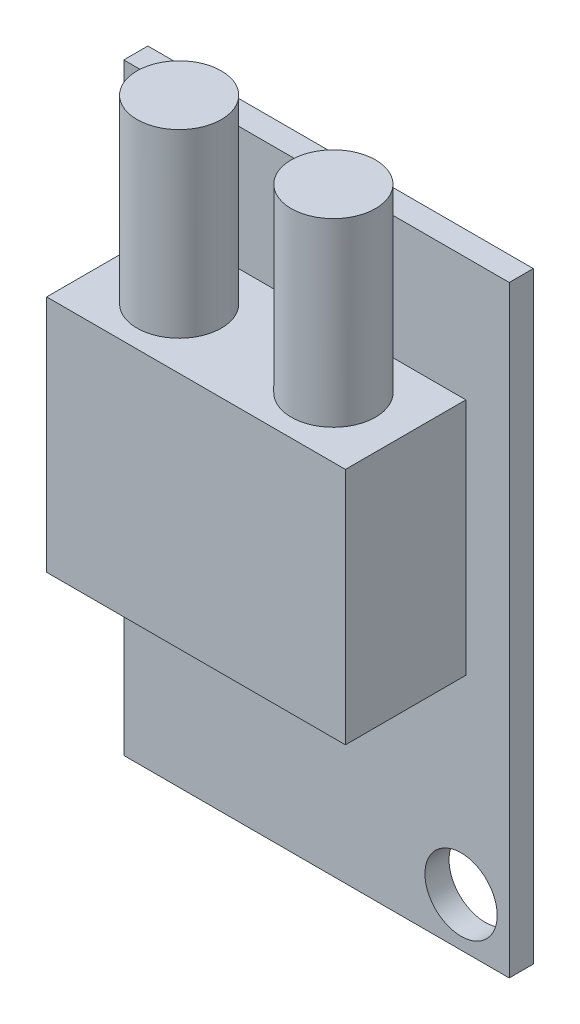
ISO-10303-21;
HEADER;
FILE_DESCRIPTION(('STEP AP214'),'2;1');
FILE_NAME('part.step','',(''),(''),'','','');
FILE_SCHEMA(('AUTOMOTIVE_DESIGN { 1 0 10303 214 1 1 1 1 }'));
ENDSEC;
DATA;
#1=APPLICATION_CONTEXT('core data for automotive mechanical design processes');
#2=APPLICATION_PROTOCOL_DEFINITION('international standard','automotive_design',2000,#1);
#3=PRODUCT_CONTEXT('',#1,'mechanical');
#4=PRODUCT('Part','Part','',(#3));
#5=PRODUCT_RELATED_PRODUCT_CATEGORY('part','',(#4));
#6=PRODUCT_DEFINITION_FORMATION('','',#4);
#7=PRODUCT_DEFINITION_CONTEXT('part definition',#1,'design');
#8=PRODUCT_DEFINITION('design','',#6,#7);
#9=PRODUCT_DEFINITION_SHAPE('','',#8);
#10=(LENGTH_UNIT() NAMED_UNIT(*) SI_UNIT(.MILLI.,.METRE.));
#11=(NAMED_UNIT(*) PLANE_ANGLE_UNIT() SI_UNIT($,.RADIAN.));
#12=(NAMED_UNIT(*) SI_UNIT($,.STERADIAN.) SOLID_ANGLE_UNIT());
#13=UNCERTAINTY_MEASURE_WITH_UNIT(LENGTH_MEASURE(1.E-05),#10,'distance_accuracy_value','');
#14=(GEOMETRIC_REPRESENTATION_CONTEXT(3) GLOBAL_UNCERTAINTY_ASSIGNED_CONTEXT((#13)) GLOBAL_UNIT_ASSIGNED_CONTEXT((#10,
#11,#12)) REPRESENTATION_CONTEXT('',''));
#15=CARTESIAN_POINT('',(0.,0.,0.));
#16=DIRECTION('',(0.,0.,1.));
#17=DIRECTION('',(1.,0.,0.));
#18=AXIS2_PLACEMENT_3D('',#15,#16,#17);
#19=CARTESIAN_POINT('',(0.,0.,1.));
#20=DIRECTION('',(0.,0.,-1.));
#21=DIRECTION('',(-1.,0.,0.));
#22=AXIS2_PLACEMENT_3D('',#19,#20,#21);
#23=PLANE('',#22);
#24=DIRECTION('',(0.,-1.,0.));
#25=VECTOR('',#24,1.);
#26=CARTESIAN_POINT('',(0.,0.,1.));
#27=LINE('',#26,#25);
#28=CARTESIAN_POINT('',(0.,25.,1.));
#29=VERTEX_POINT('',#28);
#30=CARTESIAN_POINT('',(0.,0.,1.));
#31=VERTEX_POINT('',#30);
#32=EDGE_CURVE('E137',#29,#31,#27,.T.);
#33=ORIENTED_EDGE('',*,*,#32,.T.);
#34=DIRECTION('',(1.,0.,0.));
#35=VECTOR('',#34,1.);
#36=CARTESIAN_POINT('',(0.,0.,1.));
#37=LINE('',#36,#35);
#38=CARTESIAN_POINT('',(16.,0.,1.));
#39=VERTEX_POINT('',#38);
#40=EDGE_CURVE('E140',#31,#39,#37,.T.);
#41=ORIENTED_EDGE('',*,*,#40,.T.);
#42=DIRECTION('',(0.,1.,0.));
#43=VECTOR('',#42,1.);
#44=CARTESIAN_POINT('',(16.,0.,1.));
#45=LINE('',#44,#43);
#46=CARTESIAN_POINT('',(16.,25.,1.));
#47=VERTEX_POINT('',#46);
#48=EDGE_CURVE('E143',#39,#47,#45,.T.);
#49=ORIENTED_EDGE('',*,*,#48,.T.);
#50=DIRECTION('',(-1.,0.,0.));
#51=VECTOR('',#50,1.);
#52=CARTESIAN_POINT('',(0.,25.,1.));
#53=LINE('',#52,#51);
#54=EDGE_CURVE('E145',#47,#29,#53,.T.);
#55=ORIENTED_EDGE('',*,*,#54,.T.);
#56=EDGE_LOOP('',(#33,#41,#49,#55));
#57=FACE_BOUND('',#56,.T.);
#58=CARTESIAN_POINT('',(2.,23.,1.));
#59=DIRECTION('',(0.,0.,1.));
#60=DIRECTION('',(1.,0.,0.));
#61=AXIS2_PLACEMENT_3D('',#58,#59,#60);
#62=CIRCLE('',#61,1.5);
#63=CARTESIAN_POINT('',(3.5,23.,1.));
#64=VERTEX_POINT('',#63);
#65=EDGE_CURVE('E129',#64,#64,#62,.T.);
#66=ORIENTED_EDGE('',*,*,#65,.F.);
#67=EDGE_LOOP('',(#66));
#68=FACE_BOUND('',#67,.T.);
#69=CARTESIAN_POINT('',(14.,2.,1.));
#70=DIRECTION('',(0.,0.,1.));
#71=DIRECTION('',(1.,0.,0.));
#72=AXIS2_PLACEMENT_3D('',#69,#70,#71);
#73=CIRCLE('',#72,1.5);
#74=CARTESIAN_POINT('',(15.5,2.,1.));
#75=VERTEX_POINT('',#74);
#76=EDGE_CURVE('E119',#75,#75,#73,.T.);
#77=ORIENTED_EDGE('',*,*,#76,.F.);
#78=EDGE_LOOP('',(#77));
#79=FACE_BOUND('',#78,.T.);
#80=DIRECTION('',(0.,-1.,0.));
#81=VECTOR('',#80,1.);
#82=CARTESIAN_POINT('',(1.8,19.8816424786027,1.));
#83=LINE('',#82,#81);
#84=CARTESIAN_POINT('',(1.8,19.8816424786027,1.));
#85=VERTEX_POINT('',#84);
#86=CARTESIAN_POINT('',(1.8,9.98164247860267,1.));
#87=VERTEX_POINT('',#86);
#88=EDGE_CURVE('E118',#85,#87,#83,.T.);
#89=ORIENTED_EDGE('',*,*,#88,.F.);
#90=DIRECTION('',(-1.,0.,0.));
#91=VECTOR('',#90,1.);
#92=CARTESIAN_POINT('',(1.8,19.8816424786027,1.));
#93=LINE('',#92,#91);
#94=CARTESIAN_POINT('',(14.2,19.8816424786027,1.));
#95=VERTEX_POINT('',#94);
#96=EDGE_CURVE('E115',#95,#85,#93,.T.);
#97=ORIENTED_EDGE('',*,*,#96,.F.);
#98=DIRECTION('',(0.,1.,0.));
#99=VECTOR('',#98,1.);
#100=CARTESIAN_POINT('',(14.2,19.8816424786027,1.));
#101=LINE('',#100,#99);
#102=CARTESIAN_POINT('',(14.2,9.98164247860267,1.));
#103=VERTEX_POINT('',#102);
#104=EDGE_CURVE('E53',#103,#95,#101,.T.);
#105=ORIENTED_EDGE('',*,*,#104,.F.);
#106=DIRECTION('',(1.,0.,0.));
#107=VECTOR('',#106,1.);
#108=CARTESIAN_POINT('',(1.8,9.98164247860267,1.));
#109=LINE('',#108,#107);
#110=EDGE_CURVE('E48',#87,#103,#109,.T.);
#111=ORIENTED_EDGE('',*,*,#110,.F.);
#112=EDGE_LOOP('',(#89,#97,#105,#111));
#113=FACE_BOUND('',#112,.T.);
#114=ADVANCED_FACE('F33',(#57,#68,#79,#113),#23,.F.);
#115=CARTESIAN_POINT('',(0.,0.,1.));
#116=DIRECTION('',(1.,0.,0.));
#117=DIRECTION('',(0.,0.,-1.));
#118=AXIS2_PLACEMENT_3D('',#115,#116,#117);
#119=PLANE('',#118);
#120=DIRECTION('',(0.,-1.,0.));
#121=VECTOR('',#120,1.);
#122=CARTESIAN_POINT('',(0.,0.,0.));
#123=LINE('',#122,#121);
#124=CARTESIAN_POINT('',(0.,25.,0.));
#125=VERTEX_POINT('',#124);
#126=CARTESIAN_POINT('',(0.,0.,0.));
#127=VERTEX_POINT('',#126);
#128=EDGE_CURVE('E134',#125,#127,#123,.T.);
#129=ORIENTED_EDGE('',*,*,#128,.T.);
#130=DIRECTION('',(0.,0.,-1.));
#131=VECTOR('',#130,1.);
#132=CARTESIAN_POINT('',(0.,0.,1.));
#133=LINE('',#132,#131);
#134=EDGE_CURVE('E163',#31,#127,#133,.T.);
#135=ORIENTED_EDGE('',*,*,#134,.F.);
#136=ORIENTED_EDGE('',*,*,#32,.F.);
#137=DIRECTION('',(0.,0.,-1.));
#138=VECTOR('',#137,1.);
#139=CARTESIAN_POINT('',(0.,25.,1.));
#140=LINE('',#139,#138);
#141=EDGE_CURVE('E147',#29,#125,#140,.T.);
#142=ORIENTED_EDGE('',*,*,#141,.T.);
#143=EDGE_LOOP('',(#129,#135,#136,#142));
#144=FACE_BOUND('',#143,.T.);
#145=ADVANCED_FACE('F35',(#144),#119,.F.);
#146=CARTESIAN_POINT('',(0.,0.,1.));
#147=DIRECTION('',(0.,1.,0.));
#148=DIRECTION('',(0.,0.,1.));
#149=AXIS2_PLACEMENT_3D('',#146,#147,#148);
#150=PLANE('',#149);
#151=DIRECTION('',(1.,0.,0.));
#152=VECTOR('',#151,1.);
#153=CARTESIAN_POINT('',(0.,0.,0.));
#154=LINE('',#153,#152);
#155=CARTESIAN_POINT('',(16.,0.,0.));
#156=VERTEX_POINT('',#155);
#157=EDGE_CURVE('E150',#127,#156,#154,.T.);
#158=ORIENTED_EDGE('',*,*,#157,.T.);
#159=DIRECTION('',(0.,0.,-1.));
#160=VECTOR('',#159,1.);
#161=CARTESIAN_POINT('',(16.,0.,1.));
#162=LINE('',#161,#160);
#163=EDGE_CURVE('E160',#39,#156,#162,.T.);
#164=ORIENTED_EDGE('',*,*,#163,.F.);
#165=ORIENTED_EDGE('',*,*,#40,.F.);
#166=ORIENTED_EDGE('',*,*,#134,.T.);
#167=EDGE_LOOP('',(#158,#164,#165,#166));
#168=FACE_BOUND('',#167,.T.);
#169=ADVANCED_FACE('F216',(#168),#150,.F.);
#170=CARTESIAN_POINT('',(16.,0.,1.));
#171=DIRECTION('',(-1.,0.,0.));
#172=DIRECTION('',(0.,0.,1.));
#173=AXIS2_PLACEMENT_3D('',#170,#171,#172);
#174=PLANE('',#173);
#175=DIRECTION('',(0.,1.,0.));
#176=VECTOR('',#175,1.);
#177=CARTESIAN_POINT('',(16.,0.,0.));
#178=LINE('',#177,#176);
#179=CARTESIAN_POINT('',(16.,25.,0.));
#180=VERTEX_POINT('',#179);
#181=EDGE_CURVE('E152',#156,#180,#178,.T.);
#182=ORIENTED_EDGE('',*,*,#181,.T.);
#183=DIRECTION('',(0.,0.,-1.));
#184=VECTOR('',#183,1.);
#185=CARTESIAN_POINT('',(16.,25.,1.));
#186=LINE('',#185,#184);
#187=EDGE_CURVE('E157',#47,#180,#186,.T.);
#188=ORIENTED_EDGE('',*,*,#187,.F.);
#189=ORIENTED_EDGE('',*,*,#48,.F.);
#190=ORIENTED_EDGE('',*,*,#163,.T.);
#191=EDGE_LOOP('',(#182,#188,#189,#190));
#192=FACE_BOUND('',#191,.T.);
#193=ADVANCED_FACE('F230',(#192),#174,.F.);
#194=CARTESIAN_POINT('',(0.,25.,1.));
#195=DIRECTION('',(0.,-1.,0.));
#196=DIRECTION('',(0.,0.,-1.));
#197=AXIS2_PLACEMENT_3D('',#194,#195,#196);
#198=PLANE('',#197);
#199=DIRECTION('',(-1.,0.,0.));
#200=VECTOR('',#199,1.);
#201=CARTESIAN_POINT('',(0.,25.,0.));
#202=LINE('',#201,#200);
#203=EDGE_CURVE('E141',#180,#125,#202,.T.);
#204=ORIENTED_EDGE('',*,*,#203,.T.);
#205=ORIENTED_EDGE('',*,*,#141,.F.);
#206=ORIENTED_EDGE('',*,*,#54,.F.);
#207=ORIENTED_EDGE('',*,*,#187,.T.);
#208=EDGE_LOOP('',(#204,#205,#206,#207));
#209=FACE_BOUND('',#208,.T.);
#210=ADVANCED_FACE('F226',(#209),#198,.F.);
#211=CARTESIAN_POINT('',(0.,0.,0.));
#212=DIRECTION('',(0.,0.,-1.));
#213=DIRECTION('',(-1.,0.,0.));
#214=AXIS2_PLACEMENT_3D('',#211,#212,#213);
#215=PLANE('',#214);
#216=CARTESIAN_POINT('',(14.,2.,0.));
#217=DIRECTION('',(0.,0.,1.));
#218=DIRECTION('',(1.,0.,0.));
#219=AXIS2_PLACEMENT_3D('',#216,#217,#218);
#220=CIRCLE('',#219,1.5);
#221=CARTESIAN_POINT('',(15.5,2.,0.));
#222=VERTEX_POINT('',#221);
#223=EDGE_CURVE('E122',#222,#222,#220,.T.);
#224=ORIENTED_EDGE('',*,*,#223,.T.);
#225=EDGE_LOOP('',(#224));
#226=FACE_BOUND('',#225,.T.);
#227=CARTESIAN_POINT('',(2.,23.,0.));
#228=DIRECTION('',(0.,0.,1.));
#229=DIRECTION('',(1.,0.,0.));
#230=AXIS2_PLACEMENT_3D('',#227,#228,#229);
#231=CIRCLE('',#230,1.5);
#232=CARTESIAN_POINT('',(3.5,23.,0.));
#233=VERTEX_POINT('',#232);
#234=EDGE_CURVE('E131',#233,#233,#231,.T.);
#235=ORIENTED_EDGE('',*,*,#234,.T.);
#236=EDGE_LOOP('',(#235));
#237=FACE_BOUND('',#236,.T.);
#238=ORIENTED_EDGE('',*,*,#128,.F.);
#239=ORIENTED_EDGE('',*,*,#203,.F.);
#240=ORIENTED_EDGE('',*,*,#181,.F.);
#241=ORIENTED_EDGE('',*,*,#157,.F.);
#242=EDGE_LOOP('',(#238,#239,#240,#241));
#243=FACE_BOUND('',#242,.T.);
#244=ADVANCED_FACE('F223',(#226,#237,#243),#215,.T.);
#245=CARTESIAN_POINT('',(2.,23.,0.));
#246=DIRECTION('',(0.,0.,1.));
#247=DIRECTION('',(1.,0.,0.));
#248=AXIS2_PLACEMENT_3D('',#245,#246,#247);
#249=CYLINDRICAL_SURFACE('',#248,1.5);
#250=ORIENTED_EDGE('',*,*,#234,.F.);
#251=EDGE_LOOP('',(#250));
#252=FACE_BOUND('',#251,.T.);
#253=ORIENTED_EDGE('',*,*,#65,.T.);
#254=EDGE_LOOP('',(#253));
#255=FACE_BOUND('',#254,.T.);
#256=ADVANCED_FACE('F221',(#252,#255),#249,.F.);
#257=CARTESIAN_POINT('',(14.,2.,0.));
#258=DIRECTION('',(0.,0.,1.));
#259=DIRECTION('',(1.,0.,0.));
#260=AXIS2_PLACEMENT_3D('',#257,#258,#259);
#261=CYLINDRICAL_SURFACE('',#260,1.5);
#262=ORIENTED_EDGE('',*,*,#223,.F.);
#263=EDGE_LOOP('',(#262));
#264=FACE_BOUND('',#263,.T.);
#265=ORIENTED_EDGE('',*,*,#76,.T.);
#266=EDGE_LOOP('',(#265));
#267=FACE_BOUND('',#266,.T.);
#268=ADVANCED_FACE('F269',(#264,#267),#261,.F.);
#269=CARTESIAN_POINT('',(1.8,19.8816424786027,6.));
#270=DIRECTION('',(1.,0.,0.));
#271=DIRECTION('',(0.,0.,-1.));
#272=AXIS2_PLACEMENT_3D('',#269,#270,#271);
#273=PLANE('',#272);
#274=ORIENTED_EDGE('',*,*,#88,.T.);
#275=DIRECTION('',(0.,0.,-1.));
#276=VECTOR('',#275,1.);
#277=CARTESIAN_POINT('',(1.8,9.98164247860267,6.));
#278=LINE('',#277,#276);
#279=CARTESIAN_POINT('',(1.8,9.98164247860267,6.));
#280=VERTEX_POINT('',#279);
#281=EDGE_CURVE('E99',#280,#87,#278,.T.);
#282=ORIENTED_EDGE('',*,*,#281,.F.);
#283=DIRECTION('',(0.,-1.,0.));
#284=VECTOR('',#283,1.);
#285=CARTESIAN_POINT('',(1.8,19.8816424786027,6.));
#286=LINE('',#285,#284);
#287=CARTESIAN_POINT('',(1.8,19.8816424786027,6.));
#288=VERTEX_POINT('',#287);
#289=EDGE_CURVE('E106',#288,#280,#286,.T.);
#290=ORIENTED_EDGE('',*,*,#289,.F.);
#291=DIRECTION('',(0.,0.,-1.));
#292=VECTOR('',#291,1.);
#293=CARTESIAN_POINT('',(1.8,19.8816424786027,6.));
#294=LINE('',#293,#292);
#295=EDGE_CURVE('E178',#288,#85,#294,.T.);
#296=ORIENTED_EDGE('',*,*,#295,.T.);
#297=EDGE_LOOP('',(#274,#282,#290,#296));
#298=FACE_BOUND('',#297,.T.);
#299=ADVANCED_FACE('F117',(#298),#273,.F.);
#300=CARTESIAN_POINT('',(1.8,9.98164247860267,6.));
#301=DIRECTION('',(0.,1.,0.));
#302=DIRECTION('',(0.,0.,1.));
#303=AXIS2_PLACEMENT_3D('',#300,#301,#302);
#304=PLANE('',#303);
#305=ORIENTED_EDGE('',*,*,#110,.T.);
#306=DIRECTION('',(0.,0.,-1.));
#307=VECTOR('',#306,1.);
#308=CARTESIAN_POINT('',(14.2,9.98164247860267,6.));
#309=LINE('',#308,#307);
#310=CARTESIAN_POINT('',(14.2,9.98164247860267,6.));
#311=VERTEX_POINT('',#310);
#312=EDGE_CURVE('E102',#311,#103,#309,.T.);
#313=ORIENTED_EDGE('',*,*,#312,.F.);
#314=DIRECTION('',(1.,0.,0.));
#315=VECTOR('',#314,1.);
#316=CARTESIAN_POINT('',(1.8,9.98164247860267,6.));
#317=LINE('',#316,#315);
#318=EDGE_CURVE('E95',#280,#311,#317,.T.);
#319=ORIENTED_EDGE('',*,*,#318,.F.);
#320=ORIENTED_EDGE('',*,*,#281,.T.);
#321=EDGE_LOOP('',(#305,#313,#319,#320));
#322=FACE_BOUND('',#321,.T.);
#323=ADVANCED_FACE('F97',(#322),#304,.F.);
#324=CARTESIAN_POINT('',(14.2,19.8816424786027,6.));
#325=DIRECTION('',(-1.,0.,0.));
#326=DIRECTION('',(0.,0.,1.));
#327=AXIS2_PLACEMENT_3D('',#324,#325,#326);
#328=PLANE('',#327);
#329=ORIENTED_EDGE('',*,*,#104,.T.);
#330=DIRECTION('',(0.,0.,-1.));
#331=VECTOR('',#330,1.);
#332=CARTESIAN_POINT('',(14.2,19.8816424786027,6.));
#333=LINE('',#332,#331);
#334=CARTESIAN_POINT('',(14.2,19.8816424786027,6.));
#335=VERTEX_POINT('',#334);
#336=EDGE_CURVE('E124',#335,#95,#333,.T.);
#337=ORIENTED_EDGE('',*,*,#336,.F.);
#338=DIRECTION('',(0.,1.,0.));
#339=VECTOR('',#338,1.);
#340=CARTESIAN_POINT('',(14.2,19.8816424786027,6.));
#341=LINE('',#340,#339);
#342=EDGE_CURVE('E105',#311,#335,#341,.T.);
#343=ORIENTED_EDGE('',*,*,#342,.F.);
#344=ORIENTED_EDGE('',*,*,#312,.T.);
#345=EDGE_LOOP('',(#329,#337,#343,#344));
#346=FACE_BOUND('',#345,.T.);
#347=ADVANCED_FACE('F173',(#346),#328,.F.);
#348=CARTESIAN_POINT('',(1.8,19.8816424786027,6.));
#349=DIRECTION('',(0.,-1.,0.));
#350=DIRECTION('',(0.,0.,-1.));
#351=AXIS2_PLACEMENT_3D('',#348,#349,#350);
#352=PLANE('',#351);
#353=CARTESIAN_POINT('',(11.2,19.8816424786027,3.5));
#354=DIRECTION('',(0.,-1.,0.));
#355=DIRECTION('',(0.,0.,-1.));
#356=AXIS2_PLACEMENT_3D('',#353,#354,#355);
#357=CIRCLE('',#356,1.75);
#358=CARTESIAN_POINT('',(11.2,19.8816424786027,1.75));
#359=VERTEX_POINT('',#358);
#360=EDGE_CURVE('E11',#359,#359,#357,.F.);
#361=ORIENTED_EDGE('',*,*,#360,.F.);
#362=EDGE_LOOP('',(#361));
#363=FACE_BOUND('',#362,.T.);
#364=CARTESIAN_POINT('',(4.8,19.8816424786027,3.5));
#365=DIRECTION('',(0.,-1.,0.));
#366=DIRECTION('',(0.,0.,-1.));
#367=AXIS2_PLACEMENT_3D('',#364,#365,#366);
#368=CIRCLE('',#367,1.75);
#369=CARTESIAN_POINT('',(4.8,19.8816424786027,1.75));
#370=VERTEX_POINT('',#369);
#371=EDGE_CURVE('E41',#370,#370,#368,.F.);
#372=ORIENTED_EDGE('',*,*,#371,.F.);
#373=EDGE_LOOP('',(#372));
#374=FACE_BOUND('',#373,.T.);
#375=ORIENTED_EDGE('',*,*,#96,.T.);
#376=ORIENTED_EDGE('',*,*,#295,.F.);
#377=DIRECTION('',(-1.,0.,0.));
#378=VECTOR('',#377,1.);
#379=CARTESIAN_POINT('',(1.8,19.8816424786027,6.));
#380=LINE('',#379,#378);
#381=EDGE_CURVE('E111',#335,#288,#380,.T.);
#382=ORIENTED_EDGE('',*,*,#381,.F.);
#383=ORIENTED_EDGE('',*,*,#336,.T.);
#384=EDGE_LOOP('',(#375,#376,#382,#383));
#385=FACE_BOUND('',#384,.T.);
#386=ADVANCED_FACE('F170',(#363,#374,#385),#352,.F.);
#387=CARTESIAN_POINT('',(0.,0.,6.));
#388=DIRECTION('',(0.,0.,1.));
#389=DIRECTION('',(1.,0.,0.));
#390=AXIS2_PLACEMENT_3D('',#387,#388,#389);
#391=PLANE('',#390);
#392=ORIENTED_EDGE('',*,*,#289,.T.);
#393=ORIENTED_EDGE('',*,*,#318,.T.);
#394=ORIENTED_EDGE('',*,*,#342,.T.);
#395=ORIENTED_EDGE('',*,*,#381,.T.);
#396=EDGE_LOOP('',(#392,#393,#394,#395));
#397=FACE_BOUND('',#396,.T.);
#398=ADVANCED_FACE('F109',(#397),#391,.T.);
#399=CARTESIAN_POINT('',(4.8,27.3816424786027,3.5));
#400=DIRECTION('',(0.,-1.,0.));
#401=DIRECTION('',(0.,0.,-1.));
#402=AXIS2_PLACEMENT_3D('',#399,#400,#401);
#403=CYLINDRICAL_SURFACE('',#402,1.75);
#404=CARTESIAN_POINT('',(4.8,27.3816424786027,3.5));
#405=DIRECTION('',(0.,1.,0.));
#406=DIRECTION('',(0.,0.,1.));
#407=AXIS2_PLACEMENT_3D('',#404,#405,#406);
#408=CIRCLE('',#407,1.75);
#409=CARTESIAN_POINT('',(4.8,27.3816424786027,5.25));
#410=VERTEX_POINT('',#409);
#411=EDGE_CURVE('E186',#410,#410,#408,.T.);
#412=ORIENTED_EDGE('',*,*,#411,.F.);
#413=EDGE_LOOP('',(#412));
#414=FACE_BOUND('',#413,.T.);
#415=ORIENTED_EDGE('',*,*,#371,.T.);
#416=EDGE_LOOP('',(#415));
#417=FACE_BOUND('',#416,.T.);
#418=ADVANCED_FACE('F168',(#414,#417),#403,.T.);
#419=CARTESIAN_POINT('',(4.8,27.3816424786027,3.5));
#420=DIRECTION('',(0.,1.,0.));
#421=DIRECTION('',(0.,0.,1.));
#422=AXIS2_PLACEMENT_3D('',#419,#420,#421);
#423=PLANE('',#422);
#424=ORIENTED_EDGE('',*,*,#411,.T.);
#425=EDGE_LOOP('',(#424));
#426=FACE_BOUND('',#425,.T.);
#427=ADVANCED_FACE('F200',(#426),#423,.T.);
#428=CARTESIAN_POINT('',(11.2,27.3816424786027,3.5));
#429=DIRECTION('',(0.,-1.,0.));
#430=DIRECTION('',(0.,0.,-1.));
#431=AXIS2_PLACEMENT_3D('',#428,#429,#430);
#432=CYLINDRICAL_SURFACE('',#431,1.75);
#433=CARTESIAN_POINT('',(11.2,27.3816424786027,3.5));
#434=DIRECTION('',(0.,1.,0.));
#435=DIRECTION('',(0.,0.,1.));
#436=AXIS2_PLACEMENT_3D('',#433,#434,#435);
#437=CIRCLE('',#436,1.75);
#438=CARTESIAN_POINT('',(11.2,27.3816424786027,5.25));
#439=VERTEX_POINT('',#438);
#440=EDGE_CURVE('E191',#439,#439,#437,.T.);
#441=ORIENTED_EDGE('',*,*,#440,.F.);
#442=EDGE_LOOP('',(#441));
#443=FACE_BOUND('',#442,.T.);
#444=ORIENTED_EDGE('',*,*,#360,.T.);
#445=EDGE_LOOP('',(#444));
#446=FACE_BOUND('',#445,.T.);
#447=ADVANCED_FACE('F197',(#443,#446),#432,.T.);
#448=CARTESIAN_POINT('',(11.2,27.3816424786027,3.5));
#449=DIRECTION('',(0.,1.,0.));
#450=DIRECTION('',(0.,0.,1.));
#451=AXIS2_PLACEMENT_3D('',#448,#449,#450);
#452=PLANE('',#451);
#453=ORIENTED_EDGE('',*,*,#440,.T.);
#454=EDGE_LOOP('',(#453));
#455=FACE_BOUND('',#454,.T.);
#456=ADVANCED_FACE('F195',(#455),#452,.T.);
#457=CLOSED_SHELL('',(#114,#145,#169,#193,#210,#244,#256,#268,#299,#323,#347,#386,#398,#418,
#427,#447,#456));
#458=MANIFOLD_SOLID_BREP('B2',#457);
#459=ADVANCED_BREP_SHAPE_REPRESENTATION('',(#18,#458),#14);
#460=SHAPE_DEFINITION_REPRESENTATION(#9,#459);
ENDSEC;
END-ISO-10303-21;
